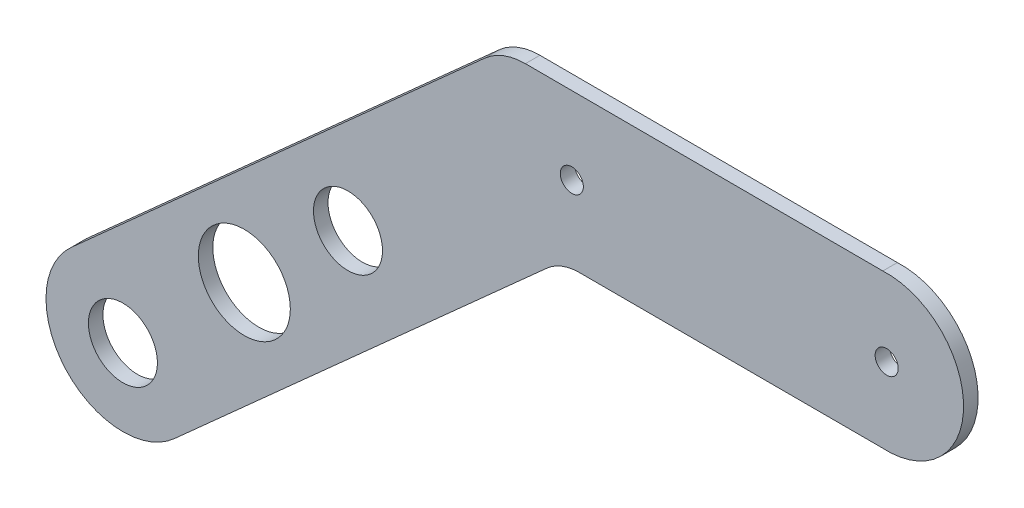
ISO-10303-21;
HEADER;
FILE_DESCRIPTION(('STEP AP214'),'2;1');
FILE_NAME('part.step','',(''),(''),'','','');
FILE_SCHEMA(('AUTOMOTIVE_DESIGN { 1 0 10303 214 1 1 1 1 }'));
ENDSEC;
DATA;
#1=APPLICATION_CONTEXT('core data for automotive mechanical design processes');
#2=APPLICATION_PROTOCOL_DEFINITION('international standard','automotive_design',2000,#1);
#3=PRODUCT_CONTEXT('',#1,'mechanical');
#4=PRODUCT('Part','Part','',(#3));
#5=PRODUCT_RELATED_PRODUCT_CATEGORY('part','',(#4));
#6=PRODUCT_DEFINITION_FORMATION('','',#4);
#7=PRODUCT_DEFINITION_CONTEXT('part definition',#1,'design');
#8=PRODUCT_DEFINITION('design','',#6,#7);
#9=PRODUCT_DEFINITION_SHAPE('','',#8);
#10=(LENGTH_UNIT() NAMED_UNIT(*) SI_UNIT(.MILLI.,.METRE.));
#11=(NAMED_UNIT(*) PLANE_ANGLE_UNIT() SI_UNIT($,.RADIAN.));
#12=(NAMED_UNIT(*) SI_UNIT($,.STERADIAN.) SOLID_ANGLE_UNIT());
#13=UNCERTAINTY_MEASURE_WITH_UNIT(LENGTH_MEASURE(1.E-05),#10,'distance_accuracy_value','');
#14=(GEOMETRIC_REPRESENTATION_CONTEXT(3) GLOBAL_UNCERTAINTY_ASSIGNED_CONTEXT((#13)) GLOBAL_UNIT_ASSIGNED_CONTEXT((#10,
#11,#12)) REPRESENTATION_CONTEXT('',''));
#15=CARTESIAN_POINT('',(0.,0.,0.));
#16=DIRECTION('',(0.,0.,1.));
#17=DIRECTION('',(1.,0.,0.));
#18=AXIS2_PLACEMENT_3D('',#15,#16,#17);
#19=CARTESIAN_POINT('',(-81.8635613078757,91.3431140107326,6.));
#20=DIRECTION('',(-0.667408215013844,0.744692066918961,0.));
#21=DIRECTION('',(-0.744692066918961,-0.667408215013844,0.));
#22=AXIS2_PLACEMENT_3D('',#19,#20,#21);
#23=PLANE('',#22);
#24=DIRECTION('',(0.744692066918962,0.667408215013844,0.));
#25=VECTOR('',#24,1.);
#26=CARTESIAN_POINT('',(-81.8635613078757,91.3431140107326,6.));
#27=LINE('',#26,#25);
#28=CARTESIAN_POINT('',(-136.250697374015,42.6002536875446,6.));
#29=VERTEX_POINT('',#28);
#30=CARTESIAN_POINT('',(34.3828075980542,195.525480145419,6.));
#31=VERTEX_POINT('',#30);
#32=EDGE_CURVE('E109',#29,#31,#27,.T.);
#33=ORIENTED_EDGE('',*,*,#32,.T.);
#34=DIRECTION('',(0.,0.,-1.));
#35=VECTOR('',#34,1.);
#36=CARTESIAN_POINT('',(34.3828075980541,195.525480145419,6.));
#37=LINE('',#36,#35);
#38=CARTESIAN_POINT('',(34.3828075980542,195.525480145419,0.));
#39=VERTEX_POINT('',#38);
#40=EDGE_CURVE('E116',#31,#39,#37,.T.);
#41=ORIENTED_EDGE('',*,*,#40,.T.);
#42=DIRECTION('',(0.744692066918962,0.667408215013844,0.));
#43=VECTOR('',#42,1.);
#44=CARTESIAN_POINT('',(-81.8635613078757,91.3431140107326,0.));
#45=LINE('',#44,#43);
#46=CARTESIAN_POINT('',(-136.250697374015,42.6002536875446,0.));
#47=VERTEX_POINT('',#46);
#48=EDGE_CURVE('E112',#47,#39,#45,.T.);
#49=ORIENTED_EDGE('',*,*,#48,.F.);
#50=DIRECTION('',(0.,0.,-1.));
#51=VECTOR('',#50,1.);
#52=CARTESIAN_POINT('',(-136.250697374015,42.6002536875446,6.));
#53=LINE('',#52,#51);
#54=EDGE_CURVE('E105',#29,#47,#53,.T.);
#55=ORIENTED_EDGE('',*,*,#54,.F.);
#56=EDGE_LOOP('',(#33,#41,#49,#55));
#57=FACE_BOUND('',#56,.T.);
#58=ADVANCED_FACE('F42',(#57),#23,.T.);
#59=CARTESIAN_POINT('',(-115.060486547325,18.9562805628676,6.));
#60=DIRECTION('',(0.,0.,-1.));
#61=DIRECTION('',(-1.,0.,0.));
#62=AXIS2_PLACEMENT_3D('',#59,#60,#61);
#63=CYLINDRICAL_SURFACE('',#62,31.75);
#64=CARTESIAN_POINT('',(-115.060486547325,18.9562805628676,0.));
#65=DIRECTION('',(0.,0.,1.));
#66=DIRECTION('',(1.,0.,0.));
#67=AXIS2_PLACEMENT_3D('',#64,#65,#66);
#68=CIRCLE('',#67,31.75);
#69=CARTESIAN_POINT('',(-93.6273654438487,-4.46772037129602,0.));
#70=VERTEX_POINT('',#69);
#71=EDGE_CURVE('E163',#47,#70,#68,.T.);
#72=ORIENTED_EDGE('',*,*,#71,.T.);
#73=DIRECTION('',(0.,0.,-1.));
#74=VECTOR('',#73,1.);
#75=CARTESIAN_POINT('',(-93.6273654438487,-4.46772037129602,6.));
#76=LINE('',#75,#74);
#77=CARTESIAN_POINT('',(-93.6273654438487,-4.46772037129602,6.));
#78=VERTEX_POINT('',#77);
#79=EDGE_CURVE('E117',#78,#70,#76,.T.);
#80=ORIENTED_EDGE('',*,*,#79,.F.);
#81=CARTESIAN_POINT('',(-115.060486547325,18.9562805628676,6.));
#82=DIRECTION('',(0.,0.,1.));
#83=DIRECTION('',(1.,0.,0.));
#84=AXIS2_PLACEMENT_3D('',#81,#82,#83);
#85=CIRCLE('',#84,31.75);
#86=EDGE_CURVE('E121',#29,#78,#85,.T.);
#87=ORIENTED_EDGE('',*,*,#86,.F.);
#88=ORIENTED_EDGE('',*,*,#54,.T.);
#89=EDGE_LOOP('',(#72,#80,#87,#88));
#90=FACE_BOUND('',#89,.T.);
#91=ADVANCED_FACE('F122',(#90),#63,.T.);
#92=CARTESIAN_POINT('',(-39.4842683959455,44.056427207672,6.));
#93=DIRECTION('',(-0.667408215013844,0.744692066918961,0.));
#94=DIRECTION('',(-0.744692066918961,-0.667408215013844,0.));
#95=AXIS2_PLACEMENT_3D('',#92,#93,#94);
#96=PLANE('',#95);
#97=DIRECTION('',(0.744692066918961,0.667408215013844,0.));
#98=VECTOR('',#97,1.);
#99=CARTESIAN_POINT('',(-39.4842683959455,44.056427207672,0.));
#100=LINE('',#99,#98);
#101=CARTESIAN_POINT('',(60.0401251622263,133.252218066316,0.));
#102=VERTEX_POINT('',#101);
#103=EDGE_CURVE('E165',#70,#102,#100,.T.);
#104=ORIENTED_EDGE('',*,*,#103,.T.);
#105=DIRECTION('',(0.,0.,-1.));
#106=VECTOR('',#105,1.);
#107=CARTESIAN_POINT('',(60.0401251622263,133.252218066316,6.));
#108=LINE('',#107,#106);
#109=CARTESIAN_POINT('',(60.0401251622263,133.252218066316,6.));
#110=VERTEX_POINT('',#109);
#111=EDGE_CURVE('E57',#102,#110,#108,.F.);
#112=ORIENTED_EDGE('',*,*,#111,.T.);
#113=DIRECTION('',(0.744692066918961,0.667408215013844,0.));
#114=VECTOR('',#113,1.);
#115=CARTESIAN_POINT('',(-39.4842683959455,44.056427207672,6.));
#116=LINE('',#115,#114);
#117=EDGE_CURVE('E125',#78,#110,#116,.T.);
#118=ORIENTED_EDGE('',*,*,#117,.F.);
#119=ORIENTED_EDGE('',*,*,#79,.T.);
#120=EDGE_LOOP('',(#104,#112,#118,#119));
#121=FACE_BOUND('',#120,.T.);
#122=ADVANCED_FACE('F215',(#121),#96,.F.);
#123=CARTESIAN_POINT('',(0.208028825030595,138.468342113573,6.));
#124=DIRECTION('',(0.00150235488550881,0.999998871464262,0.));
#125=DIRECTION('',(-0.999998871464262,0.00150235488550881,0.));
#126=AXIS2_PLACEMENT_3D('',#123,#124,#125);
#127=PLANE('',#126);
#128=DIRECTION('',(0.999998871464262,-0.00150235488550881,0.));
#129=VECTOR('',#128,1.);
#130=CARTESIAN_POINT('',(0.208028825030595,138.468342113573,6.));
#131=LINE('',#130,#129);
#132=CARTESIAN_POINT('',(73.4183364786063,138.358354126074,6.));
#133=VERTEX_POINT('',#132);
#134=CARTESIAN_POINT('',(198.257607139714,138.170801026233,6.));
#135=VERTEX_POINT('',#134);
#136=EDGE_CURVE('E139',#133,#135,#131,.T.);
#137=ORIENTED_EDGE('',*,*,#136,.F.);
#138=DIRECTION('',(0.,0.,-1.));
#139=VECTOR('',#138,1.);
#140=CARTESIAN_POINT('',(73.4183364786063,138.358354126074,0.));
#141=LINE('',#140,#139);
#142=CARTESIAN_POINT('',(73.4183364786063,138.358354126074,0.));
#143=VERTEX_POINT('',#142);
#144=EDGE_CURVE('E187',#133,#143,#141,.T.);
#145=ORIENTED_EDGE('',*,*,#144,.T.);
#146=DIRECTION('',(0.999998871464262,-0.00150235488550881,0.));
#147=VECTOR('',#146,1.);
#148=CARTESIAN_POINT('',(0.208028825030595,138.468342113573,0.));
#149=LINE('',#148,#147);
#150=CARTESIAN_POINT('',(198.257607139714,138.170801026233,0.));
#151=VERTEX_POINT('',#150);
#152=EDGE_CURVE('E167',#143,#151,#149,.T.);
#153=ORIENTED_EDGE('',*,*,#152,.T.);
#154=DIRECTION('',(0.,0.,-1.));
#155=VECTOR('',#154,1.);
#156=CARTESIAN_POINT('',(198.257607139714,138.170801026233,6.));
#157=LINE('',#156,#155);
#158=EDGE_CURVE('E177',#135,#151,#157,.T.);
#159=ORIENTED_EDGE('',*,*,#158,.F.);
#160=EDGE_LOOP('',(#137,#145,#153,#159));
#161=FACE_BOUND('',#160,.T.);
#162=ADVANCED_FACE('F193',(#161),#127,.F.);
#163=CARTESIAN_POINT('',(200.279320139714,169.856368348685,6.));
#164=DIRECTION('',(0.,0.,-1.));
#165=DIRECTION('',(-1.,0.,0.));
#166=AXIS2_PLACEMENT_3D('',#163,#164,#165);
#167=CYLINDRICAL_SURFACE('',#166,31.75);
#168=CARTESIAN_POINT('',(200.279320139714,169.856368348685,0.));
#169=DIRECTION('',(0.,0.,1.));
#170=DIRECTION('',(1.,0.,0.));
#171=AXIS2_PLACEMENT_3D('',#168,#169,#170);
#172=CIRCLE('',#171,31.75);
#173=CARTESIAN_POINT('',(198.687933939714,201.566461220867,0.));
#174=VERTEX_POINT('',#173);
#175=EDGE_CURVE('E169',#151,#174,#172,.T.);
#176=ORIENTED_EDGE('',*,*,#175,.T.);
#177=DIRECTION('',(0.,0.,-1.));
#178=VECTOR('',#177,1.);
#179=CARTESIAN_POINT('',(198.687933939714,201.566461220867,6.));
#180=LINE('',#179,#178);
#181=CARTESIAN_POINT('',(198.687933939714,201.566461220867,6.));
#182=VERTEX_POINT('',#181);
#183=EDGE_CURVE('E146',#182,#174,#180,.T.);
#184=ORIENTED_EDGE('',*,*,#183,.F.);
#185=CARTESIAN_POINT('',(200.279320139714,169.856368348685,6.));
#186=DIRECTION('',(0.,0.,1.));
#187=DIRECTION('',(1.,0.,0.));
#188=AXIS2_PLACEMENT_3D('',#185,#186,#187);
#189=CIRCLE('',#188,31.75);
#190=EDGE_CURVE('E141',#135,#182,#189,.T.);
#191=ORIENTED_EDGE('',*,*,#190,.F.);
#192=ORIENTED_EDGE('',*,*,#158,.T.);
#193=EDGE_LOOP('',(#176,#184,#191,#192));
#194=FACE_BOUND('',#193,.T.);
#195=ADVANCED_FACE('F203',(#194),#167,.T.);
#196=CARTESIAN_POINT('',(70.2793201397136,169.856368348685,6.));
#197=DIRECTION('',(0.,0.,-1.));
#198=DIRECTION('',(-1.,0.,0.));
#199=AXIS2_PLACEMENT_3D('',#196,#197,#198);
#200=CYLINDRICAL_SURFACE('',#199,4.7625);
#201=CARTESIAN_POINT('',(70.2793201397136,169.856368348685,6.));
#202=DIRECTION('',(0.,0.,1.));
#203=DIRECTION('',(1.,0.,0.));
#204=AXIS2_PLACEMENT_3D('',#201,#202,#203);
#205=CIRCLE('',#204,4.7625);
#206=CARTESIAN_POINT('',(75.0418201397136,169.856368348685,6.));
#207=VERTEX_POINT('',#206);
#208=EDGE_CURVE('E131',#207,#207,#205,.T.);
#209=ORIENTED_EDGE('',*,*,#208,.T.);
#210=EDGE_LOOP('',(#209));
#211=FACE_BOUND('',#210,.T.);
#212=CARTESIAN_POINT('',(70.2793201397136,169.856368348685,0.));
#213=DIRECTION('',(0.,0.,1.));
#214=DIRECTION('',(1.,0.,0.));
#215=AXIS2_PLACEMENT_3D('',#212,#213,#214);
#216=CIRCLE('',#215,4.7625);
#217=CARTESIAN_POINT('',(75.0418201397136,169.856368348685,0.));
#218=VERTEX_POINT('',#217);
#219=EDGE_CURVE('E159',#218,#218,#216,.T.);
#220=ORIENTED_EDGE('',*,*,#219,.F.);
#221=EDGE_LOOP('',(#220));
#222=FACE_BOUND('',#221,.T.);
#223=ADVANCED_FACE('F219',(#211,#222),#200,.F.);
#224=CARTESIAN_POINT('',(200.279320139714,169.856368348685,6.));
#225=DIRECTION('',(0.,0.,-1.));
#226=DIRECTION('',(-1.,0.,0.));
#227=AXIS2_PLACEMENT_3D('',#224,#225,#226);
#228=CYLINDRICAL_SURFACE('',#227,4.76250000000001);
#229=CARTESIAN_POINT('',(200.279320139714,169.856368348685,6.));
#230=DIRECTION('',(0.,0.,1.));
#231=DIRECTION('',(1.,0.,0.));
#232=AXIS2_PLACEMENT_3D('',#229,#230,#231);
#233=CIRCLE('',#232,4.76250000000001);
#234=CARTESIAN_POINT('',(205.041820139714,169.856368348685,6.));
#235=VERTEX_POINT('',#234);
#236=EDGE_CURVE('E134',#235,#235,#233,.T.);
#237=ORIENTED_EDGE('',*,*,#236,.T.);
#238=EDGE_LOOP('',(#237));
#239=FACE_BOUND('',#238,.T.);
#240=CARTESIAN_POINT('',(200.279320139714,169.856368348685,0.));
#241=DIRECTION('',(0.,0.,1.));
#242=DIRECTION('',(1.,0.,0.));
#243=AXIS2_PLACEMENT_3D('',#240,#241,#242);
#244=CIRCLE('',#243,4.76250000000001);
#245=CARTESIAN_POINT('',(205.041820139714,169.856368348685,0.));
#246=VERTEX_POINT('',#245);
#247=EDGE_CURVE('E156',#246,#246,#244,.T.);
#248=ORIENTED_EDGE('',*,*,#247,.F.);
#249=EDGE_LOOP('',(#248));
#250=FACE_BOUND('',#249,.T.);
#251=ADVANCED_FACE('F222',(#239,#250),#228,.F.);
#252=CARTESIAN_POINT('',(-22.1304319710225,105.51842561742,6.));
#253=DIRECTION('',(0.,0.,-1.));
#254=DIRECTION('',(-1.,0.,0.));
#255=AXIS2_PLACEMENT_3D('',#252,#253,#254);
#256=CYLINDRICAL_SURFACE('',#255,14.25);
#257=CARTESIAN_POINT('',(-22.1304319710225,105.51842561742,6.));
#258=DIRECTION('',(0.,0.,1.));
#259=DIRECTION('',(1.,0.,0.));
#260=AXIS2_PLACEMENT_3D('',#257,#258,#259);
#261=CIRCLE('',#260,14.25);
#262=CARTESIAN_POINT('',(-7.88043197102252,105.51842561742,6.));
#263=VERTEX_POINT('',#262);
#264=EDGE_CURVE('E394',#263,#263,#261,.T.);
#265=ORIENTED_EDGE('',*,*,#264,.T.);
#266=EDGE_LOOP('',(#265));
#267=FACE_BOUND('',#266,.T.);
#268=CARTESIAN_POINT('',(-22.1304319710225,105.51842561742,0.));
#269=DIRECTION('',(0.,0.,1.));
#270=DIRECTION('',(1.,0.,0.));
#271=AXIS2_PLACEMENT_3D('',#268,#269,#270);
#272=CIRCLE('',#271,14.25);
#273=CARTESIAN_POINT('',(-7.88043197102252,105.51842561742,0.));
#274=VERTEX_POINT('',#273);
#275=EDGE_CURVE('E153',#274,#274,#272,.T.);
#276=ORIENTED_EDGE('',*,*,#275,.F.);
#277=EDGE_LOOP('',(#276));
#278=FACE_BOUND('',#277,.T.);
#279=ADVANCED_FACE('F226',(#267,#278),#256,.F.);
#280=CARTESIAN_POINT('',(-115.060486547325,18.9562805628676,6.));
#281=DIRECTION('',(0.,0.,-1.));
#282=DIRECTION('',(-1.,0.,0.));
#283=AXIS2_PLACEMENT_3D('',#280,#281,#282);
#284=CYLINDRICAL_SURFACE('',#283,14.25);
#285=CARTESIAN_POINT('',(-115.060486547325,18.9562805628676,6.));
#286=DIRECTION('',(0.,0.,1.));
#287=DIRECTION('',(1.,0.,0.));
#288=AXIS2_PLACEMENT_3D('',#285,#286,#287);
#289=CIRCLE('',#288,14.25);
#290=CARTESIAN_POINT('',(-100.810486547325,18.9562805628676,6.));
#291=VERTEX_POINT('',#290);
#292=EDGE_CURVE('E390',#291,#291,#289,.T.);
#293=ORIENTED_EDGE('',*,*,#292,.T.);
#294=EDGE_LOOP('',(#293));
#295=FACE_BOUND('',#294,.T.);
#296=CARTESIAN_POINT('',(-115.060486547325,18.9562805628676,0.));
#297=DIRECTION('',(0.,0.,1.));
#298=DIRECTION('',(1.,0.,0.));
#299=AXIS2_PLACEMENT_3D('',#296,#297,#298);
#300=CIRCLE('',#299,14.25);
#301=CARTESIAN_POINT('',(-100.810486547325,18.9562805628676,0.));
#302=VERTEX_POINT('',#301);
#303=EDGE_CURVE('E150',#302,#302,#300,.T.);
#304=ORIENTED_EDGE('',*,*,#303,.F.);
#305=EDGE_LOOP('',(#304));
#306=FACE_BOUND('',#305,.T.);
#307=ADVANCED_FACE('F230',(#295,#306),#284,.F.);
#308=CARTESIAN_POINT('',(-64.9367956931778,65.6453115568584,6.));
#309=DIRECTION('',(0.,0.,-1.));
#310=DIRECTION('',(-1.,0.,0.));
#311=AXIS2_PLACEMENT_3D('',#308,#309,#310);
#312=CYLINDRICAL_SURFACE('',#311,19.);
#313=CARTESIAN_POINT('',(-64.9367956931778,65.6453115568584,6.));
#314=DIRECTION('',(0.,0.,1.));
#315=DIRECTION('',(1.,0.,0.));
#316=AXIS2_PLACEMENT_3D('',#313,#314,#315);
#317=CIRCLE('',#316,19.);
#318=CARTESIAN_POINT('',(-45.9367956931778,65.6453115568584,6.));
#319=VERTEX_POINT('',#318);
#320=EDGE_CURVE('E174',#319,#319,#317,.T.);
#321=ORIENTED_EDGE('',*,*,#320,.T.);
#322=EDGE_LOOP('',(#321));
#323=FACE_BOUND('',#322,.T.);
#324=CARTESIAN_POINT('',(-64.9367956931778,65.6453115568584,0.));
#325=DIRECTION('',(0.,0.,1.));
#326=DIRECTION('',(1.,0.,0.));
#327=AXIS2_PLACEMENT_3D('',#324,#325,#326);
#328=CIRCLE('',#327,19.);
#329=CARTESIAN_POINT('',(-45.9367956931778,65.6453115568584,0.));
#330=VERTEX_POINT('',#329);
#331=EDGE_CURVE('E147',#330,#330,#328,.T.);
#332=ORIENTED_EDGE('',*,*,#331,.F.);
#333=EDGE_LOOP('',(#332));
#334=FACE_BOUND('',#333,.T.);
#335=ADVANCED_FACE('F234',(#323,#334),#312,.F.);
#336=CARTESIAN_POINT('',(0.467749212189578,202.025400221334,6.));
#337=DIRECTION('',(0.00231529281947574,0.999997319705988,0.));
#338=DIRECTION('',(-0.999997319705988,0.00231529281947574,0.));
#339=AXIS2_PLACEMENT_3D('',#336,#337,#338);
#340=PLANE('',#339);
#341=DIRECTION('',(0.999997319705988,-0.00231529281947574,0.));
#342=VECTOR('',#341,1.);
#343=CARTESIAN_POINT('',(0.467749212189578,202.025400221334,0.));
#344=LINE('',#343,#342);
#345=CARTESIAN_POINT('',(51.1258952938871,201.908111465094,0.));
#346=VERTEX_POINT('',#345);
#347=EDGE_CURVE('E172',#346,#174,#344,.T.);
#348=ORIENTED_EDGE('',*,*,#347,.F.);
#349=DIRECTION('',(0.,0.,-1.));
#350=VECTOR('',#349,1.);
#351=CARTESIAN_POINT('',(51.1258952938871,201.908111465094,6.));
#352=LINE('',#351,#350);
#353=CARTESIAN_POINT('',(51.1258952938871,201.908111465094,6.));
#354=VERTEX_POINT('',#353);
#355=EDGE_CURVE('E184',#346,#354,#352,.F.);
#356=ORIENTED_EDGE('',*,*,#355,.T.);
#357=DIRECTION('',(0.999997319705988,-0.00231529281947574,0.));
#358=VECTOR('',#357,1.);
#359=CARTESIAN_POINT('',(0.467749212189578,202.025400221334,6.));
#360=LINE('',#359,#358);
#361=EDGE_CURVE('E144',#354,#182,#360,.T.);
#362=ORIENTED_EDGE('',*,*,#361,.T.);
#363=ORIENTED_EDGE('',*,*,#183,.T.);
#364=EDGE_LOOP('',(#348,#356,#362,#363));
#365=FACE_BOUND('',#364,.T.);
#366=ADVANCED_FACE('F237',(#365),#340,.T.);
#367=CARTESIAN_POINT('',(0.,0.,6.));
#368=DIRECTION('',(0.,0.,1.));
#369=DIRECTION('',(1.,0.,0.));
#370=AXIS2_PLACEMENT_3D('',#367,#368,#369);
#371=PLANE('',#370);
#372=ORIENTED_EDGE('',*,*,#320,.F.);
#373=EDGE_LOOP('',(#372));
#374=FACE_BOUND('',#373,.T.);
#375=ORIENTED_EDGE('',*,*,#292,.F.);
#376=EDGE_LOOP('',(#375));
#377=FACE_BOUND('',#376,.T.);
#378=ORIENTED_EDGE('',*,*,#264,.F.);
#379=EDGE_LOOP('',(#378));
#380=FACE_BOUND('',#379,.T.);
#381=ORIENTED_EDGE('',*,*,#236,.F.);
#382=EDGE_LOOP('',(#381));
#383=FACE_BOUND('',#382,.T.);
#384=ORIENTED_EDGE('',*,*,#208,.F.);
#385=EDGE_LOOP('',(#384));
#386=FACE_BOUND('',#385,.T.);
#387=ORIENTED_EDGE('',*,*,#361,.F.);
#388=CARTESIAN_POINT('',(51.0680129734002,176.908178472445,6.));
#389=DIRECTION('',(0.,0.,1.));
#390=DIRECTION('',(1.,0.,0.));
#391=AXIS2_PLACEMENT_3D('',#388,#389,#390);
#392=CIRCLE('',#391,25.);
#393=EDGE_CURVE('E130',#354,#31,#392,.T.);
#394=ORIENTED_EDGE('',*,*,#393,.T.);
#395=ORIENTED_EDGE('',*,*,#32,.F.);
#396=ORIENTED_EDGE('',*,*,#86,.T.);
#397=ORIENTED_EDGE('',*,*,#117,.T.);
#398=CARTESIAN_POINT('',(73.3882893810794,118.358376818789,6.));
#399=DIRECTION('',(0.,0.,1.));
#400=DIRECTION('',(1.,0.,0.));
#401=AXIS2_PLACEMENT_3D('',#398,#399,#400);
#402=CIRCLE('',#401,19.999999878);
#403=EDGE_CURVE('E11',#110,#133,#402,.F.);
#404=ORIENTED_EDGE('',*,*,#403,.T.);
#405=ORIENTED_EDGE('',*,*,#136,.T.);
#406=ORIENTED_EDGE('',*,*,#190,.T.);
#407=EDGE_LOOP('',(#387,#394,#395,#396,#397,#404,#405,#406));
#408=FACE_BOUND('',#407,.T.);
#409=ADVANCED_FACE('F128',(#374,#377,#380,#383,#386,#408),#371,.T.);
#410=CARTESIAN_POINT('',(0.,0.,0.));
#411=DIRECTION('',(0.,0.,1.));
#412=DIRECTION('',(1.,0.,0.));
#413=AXIS2_PLACEMENT_3D('',#410,#411,#412);
#414=PLANE('',#413);
#415=ORIENTED_EDGE('',*,*,#331,.T.);
#416=EDGE_LOOP('',(#415));
#417=FACE_BOUND('',#416,.T.);
#418=ORIENTED_EDGE('',*,*,#303,.T.);
#419=EDGE_LOOP('',(#418));
#420=FACE_BOUND('',#419,.T.);
#421=ORIENTED_EDGE('',*,*,#275,.T.);
#422=EDGE_LOOP('',(#421));
#423=FACE_BOUND('',#422,.T.);
#424=ORIENTED_EDGE('',*,*,#247,.T.);
#425=EDGE_LOOP('',(#424));
#426=FACE_BOUND('',#425,.T.);
#427=ORIENTED_EDGE('',*,*,#219,.T.);
#428=EDGE_LOOP('',(#427));
#429=FACE_BOUND('',#428,.T.);
#430=ORIENTED_EDGE('',*,*,#48,.T.);
#431=CARTESIAN_POINT('',(51.0680129734002,176.908178472445,0.));
#432=DIRECTION('',(0.,0.,1.));
#433=DIRECTION('',(1.,0.,0.));
#434=AXIS2_PLACEMENT_3D('',#431,#432,#433);
#435=CIRCLE('',#434,25.);
#436=EDGE_CURVE('E182',#39,#346,#435,.F.);
#437=ORIENTED_EDGE('',*,*,#436,.T.);
#438=ORIENTED_EDGE('',*,*,#347,.T.);
#439=ORIENTED_EDGE('',*,*,#175,.F.);
#440=ORIENTED_EDGE('',*,*,#152,.F.);
#441=CARTESIAN_POINT('',(73.3882893810794,118.358376818789,0.));
#442=DIRECTION('',(0.,0.,1.));
#443=DIRECTION('',(1.,0.,0.));
#444=AXIS2_PLACEMENT_3D('',#441,#442,#443);
#445=CIRCLE('',#444,19.999999878);
#446=EDGE_CURVE('E50',#143,#102,#445,.T.);
#447=ORIENTED_EDGE('',*,*,#446,.T.);
#448=ORIENTED_EDGE('',*,*,#103,.F.);
#449=ORIENTED_EDGE('',*,*,#71,.F.);
#450=EDGE_LOOP('',(#430,#437,#438,#439,#440,#447,#448,#449));
#451=FACE_BOUND('',#450,.T.);
#452=ADVANCED_FACE('F198',(#417,#420,#423,#426,#429,#451),#414,.F.);
#453=CARTESIAN_POINT('',(51.0680129734002,176.908178472445,6.));
#454=DIRECTION('',(0.,0.,-1.));
#455=DIRECTION('',(-1.,0.,0.));
#456=AXIS2_PLACEMENT_3D('',#453,#454,#455);
#457=CYLINDRICAL_SURFACE('',#456,25.);
#458=ORIENTED_EDGE('',*,*,#393,.F.);
#459=ORIENTED_EDGE('',*,*,#355,.F.);
#460=ORIENTED_EDGE('',*,*,#436,.F.);
#461=ORIENTED_EDGE('',*,*,#40,.F.);
#462=EDGE_LOOP('',(#458,#459,#460,#461));
#463=FACE_BOUND('',#462,.T.);
#464=ADVANCED_FACE('F205',(#463),#457,.T.);
#465=CARTESIAN_POINT('',(73.3882893810794,118.358376818789,6.));
#466=DIRECTION('',(0.,0.,1.));
#467=DIRECTION('',(1.,0.,0.));
#468=AXIS2_PLACEMENT_3D('',#465,#466,#467);
#469=CYLINDRICAL_SURFACE('',#468,19.999999878);
#470=ORIENTED_EDGE('',*,*,#403,.F.);
#471=ORIENTED_EDGE('',*,*,#111,.F.);
#472=ORIENTED_EDGE('',*,*,#446,.F.);
#473=ORIENTED_EDGE('',*,*,#144,.F.);
#474=EDGE_LOOP('',(#470,#471,#472,#473));
#475=FACE_BOUND('',#474,.T.);
#476=ADVANCED_FACE('F44',(#475),#469,.F.);
#477=CLOSED_SHELL('',(#58,#91,#122,#162,#195,#223,#251,#279,#307,#335,#366,#409,#452,#464,#476));
#478=MANIFOLD_SOLID_BREP('B2',#477);
#479=ADVANCED_BREP_SHAPE_REPRESENTATION('',(#18,#478),#14);
#480=SHAPE_DEFINITION_REPRESENTATION(#9,#479);
ENDSEC;
END-ISO-10303-21;
